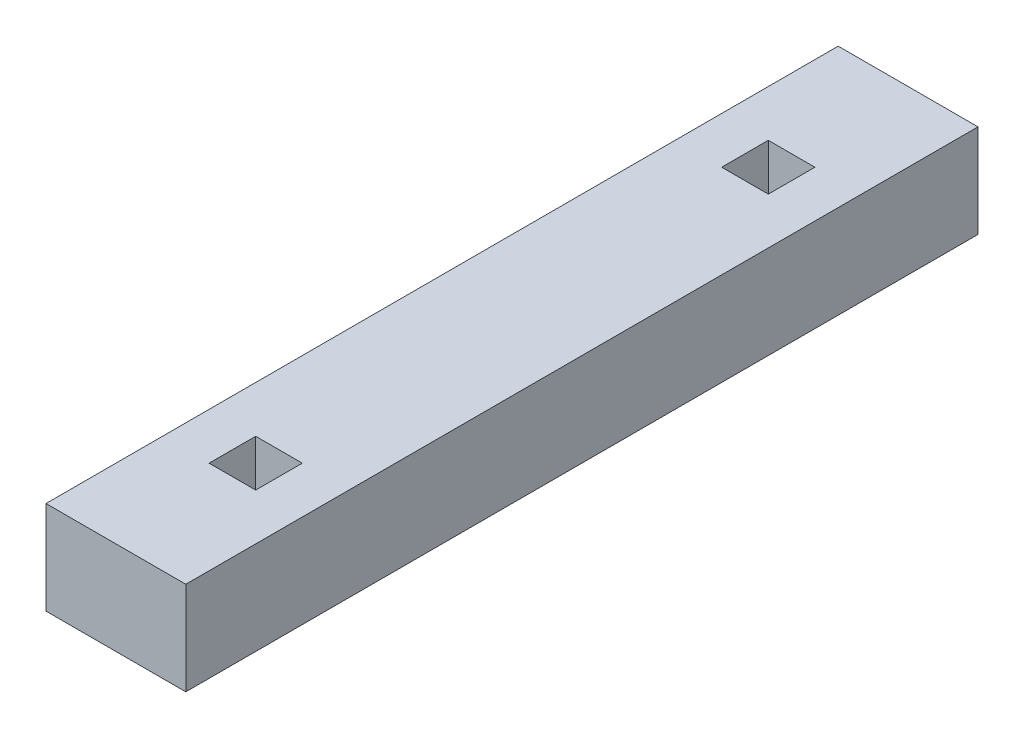
ISO-10303-21;
HEADER;
FILE_DESCRIPTION(('STEP AP214'),'2;1');
FILE_NAME('part.step','',(''),(''),'','','');
FILE_SCHEMA(('AUTOMOTIVE_DESIGN { 1 0 10303 214 1 1 1 1 }'));
ENDSEC;
DATA;
#1=APPLICATION_CONTEXT('core data for automotive mechanical design processes');
#2=APPLICATION_PROTOCOL_DEFINITION('international standard','automotive_design',2000,#1);
#3=PRODUCT_CONTEXT('',#1,'mechanical');
#4=PRODUCT('Part','Part','',(#3));
#5=PRODUCT_RELATED_PRODUCT_CATEGORY('part','',(#4));
#6=PRODUCT_DEFINITION_FORMATION('','',#4);
#7=PRODUCT_DEFINITION_CONTEXT('part definition',#1,'design');
#8=PRODUCT_DEFINITION('design','',#6,#7);
#9=PRODUCT_DEFINITION_SHAPE('','',#8);
#10=(LENGTH_UNIT() NAMED_UNIT(*) SI_UNIT(.MILLI.,.METRE.));
#11=(NAMED_UNIT(*) PLANE_ANGLE_UNIT() SI_UNIT($,.RADIAN.));
#12=(NAMED_UNIT(*) SI_UNIT($,.STERADIAN.) SOLID_ANGLE_UNIT());
#13=UNCERTAINTY_MEASURE_WITH_UNIT(LENGTH_MEASURE(1.E-05),#10,'distance_accuracy_value','');
#14=(GEOMETRIC_REPRESENTATION_CONTEXT(3) GLOBAL_UNCERTAINTY_ASSIGNED_CONTEXT((#13)) GLOBAL_UNIT_ASSIGNED_CONTEXT((#10,
#11,#12)) REPRESENTATION_CONTEXT('',''));
#15=CARTESIAN_POINT('',(0.,0.,0.));
#16=DIRECTION('',(0.,0.,1.));
#17=DIRECTION('',(1.,0.,0.));
#18=AXIS2_PLACEMENT_3D('',#15,#16,#17);
#19=CARTESIAN_POINT('',(0.,20.,0.));
#20=DIRECTION('',(0.,1.,0.));
#21=DIRECTION('',(0.,0.,1.));
#22=AXIS2_PLACEMENT_3D('',#19,#20,#21);
#23=PLANE('',#22);
#24=DIRECTION('',(0.,0.,1.));
#25=VECTOR('',#24,1.);
#26=CARTESIAN_POINT('',(-15.,20.,-80.));
#27=LINE('',#26,#25);
#28=CARTESIAN_POINT('',(-15.,20.,-80.));
#29=VERTEX_POINT('',#28);
#30=CARTESIAN_POINT('',(-15.,20.,90.));
#31=VERTEX_POINT('',#30);
#32=EDGE_CURVE('E189',#29,#31,#27,.T.);
#33=ORIENTED_EDGE('',*,*,#32,.T.);
#34=DIRECTION('',(1.,0.,0.));
#35=VECTOR('',#34,1.);
#36=CARTESIAN_POINT('',(-15.,20.,90.));
#37=LINE('',#36,#35);
#38=CARTESIAN_POINT('',(15.,20.,90.));
#39=VERTEX_POINT('',#38);
#40=EDGE_CURVE('E192',#31,#39,#37,.T.);
#41=ORIENTED_EDGE('',*,*,#40,.T.);
#42=DIRECTION('',(0.,0.,-1.));
#43=VECTOR('',#42,1.);
#44=CARTESIAN_POINT('',(15.,20.,-80.));
#45=LINE('',#44,#43);
#46=CARTESIAN_POINT('',(15.,20.,-80.));
#47=VERTEX_POINT('',#46);
#48=EDGE_CURVE('E195',#39,#47,#45,.T.);
#49=ORIENTED_EDGE('',*,*,#48,.T.);
#50=DIRECTION('',(-1.,0.,0.));
#51=VECTOR('',#50,1.);
#52=CARTESIAN_POINT('',(-15.,20.,-80.));
#53=LINE('',#52,#51);
#54=EDGE_CURVE('E197',#47,#29,#53,.T.);
#55=ORIENTED_EDGE('',*,*,#54,.T.);
#56=EDGE_LOOP('',(#33,#41,#49,#55));
#57=FACE_BOUND('',#56,.T.);
#58=DIRECTION('',(1.,0.,0.));
#59=VECTOR('',#58,1.);
#60=CARTESIAN_POINT('',(-5.,20.,-45.));
#61=LINE('',#60,#59);
#62=CARTESIAN_POINT('',(-5.,20.,-45.));
#63=VERTEX_POINT('',#62);
#64=CARTESIAN_POINT('',(5.,20.,-45.));
#65=VERTEX_POINT('',#64);
#66=EDGE_CURVE('E160',#63,#65,#61,.T.);
#67=ORIENTED_EDGE('',*,*,#66,.F.);
#68=DIRECTION('',(0.,0.,1.));
#69=VECTOR('',#68,1.);
#70=CARTESIAN_POINT('',(-5.,20.,-55.));
#71=LINE('',#70,#69);
#72=CARTESIAN_POINT('',(-5.,20.,-55.));
#73=VERTEX_POINT('',#72);
#74=EDGE_CURVE('E158',#73,#63,#71,.T.);
#75=ORIENTED_EDGE('',*,*,#74,.F.);
#76=DIRECTION('',(-1.,0.,0.));
#77=VECTOR('',#76,1.);
#78=CARTESIAN_POINT('',(-5.,20.,-55.));
#79=LINE('',#78,#77);
#80=CARTESIAN_POINT('',(5.,20.,-55.));
#81=VERTEX_POINT('',#80);
#82=EDGE_CURVE('E166',#81,#73,#79,.T.);
#83=ORIENTED_EDGE('',*,*,#82,.F.);
#84=DIRECTION('',(0.,0.,-1.));
#85=VECTOR('',#84,1.);
#86=CARTESIAN_POINT('',(5.,20.,-55.));
#87=LINE('',#86,#85);
#88=EDGE_CURVE('E163',#65,#81,#87,.T.);
#89=ORIENTED_EDGE('',*,*,#88,.F.);
#90=EDGE_LOOP('',(#67,#75,#83,#89));
#91=FACE_BOUND('',#90,.T.);
#92=DIRECTION('',(0.,0.,-1.));
#93=VECTOR('',#92,1.);
#94=CARTESIAN_POINT('',(5.,20.,65.));
#95=LINE('',#94,#93);
#96=CARTESIAN_POINT('',(5.,20.,65.));
#97=VERTEX_POINT('',#96);
#98=CARTESIAN_POINT('',(5.,20.,55.));
#99=VERTEX_POINT('',#98);
#100=EDGE_CURVE('E130',#97,#99,#95,.T.);
#101=ORIENTED_EDGE('',*,*,#100,.F.);
#102=DIRECTION('',(1.,0.,0.));
#103=VECTOR('',#102,1.);
#104=CARTESIAN_POINT('',(-5.,20.,65.));
#105=LINE('',#104,#103);
#106=CARTESIAN_POINT('',(-5.,20.,65.));
#107=VERTEX_POINT('',#106);
#108=EDGE_CURVE('E122',#107,#97,#105,.T.);
#109=ORIENTED_EDGE('',*,*,#108,.F.);
#110=DIRECTION('',(0.,0.,1.));
#111=VECTOR('',#110,1.);
#112=CARTESIAN_POINT('',(-5.,20.,65.));
#113=LINE('',#112,#111);
#114=CARTESIAN_POINT('',(-5.,20.,55.));
#115=VERTEX_POINT('',#114);
#116=EDGE_CURVE('E144',#115,#107,#113,.T.);
#117=ORIENTED_EDGE('',*,*,#116,.F.);
#118=DIRECTION('',(-1.,0.,0.));
#119=VECTOR('',#118,1.);
#120=CARTESIAN_POINT('',(-5.,20.,55.));
#121=LINE('',#120,#119);
#122=EDGE_CURVE('E142',#99,#115,#121,.T.);
#123=ORIENTED_EDGE('',*,*,#122,.F.);
#124=EDGE_LOOP('',(#101,#109,#117,#123));
#125=FACE_BOUND('',#124,.T.);
#126=ADVANCED_FACE('F33',(#57,#91,#125),#23,.T.);
#127=CARTESIAN_POINT('',(0.,0.,0.));
#128=DIRECTION('',(0.,1.,0.));
#129=DIRECTION('',(0.,0.,1.));
#130=AXIS2_PLACEMENT_3D('',#127,#128,#129);
#131=PLANE('',#130);
#132=DIRECTION('',(0.,0.,1.));
#133=VECTOR('',#132,1.);
#134=CARTESIAN_POINT('',(-5.,0.,-55.));
#135=LINE('',#134,#133);
#136=CARTESIAN_POINT('',(-5.,0.,-55.));
#137=VERTEX_POINT('',#136);
#138=CARTESIAN_POINT('',(-5.,0.,-45.));
#139=VERTEX_POINT('',#138);
#140=EDGE_CURVE('E138',#137,#139,#135,.T.);
#141=ORIENTED_EDGE('',*,*,#140,.T.);
#142=DIRECTION('',(1.,0.,0.));
#143=VECTOR('',#142,1.);
#144=CARTESIAN_POINT('',(-5.,0.,-45.));
#145=LINE('',#144,#143);
#146=CARTESIAN_POINT('',(5.,0.,-45.));
#147=VERTEX_POINT('',#146);
#148=EDGE_CURVE('E171',#139,#147,#145,.T.);
#149=ORIENTED_EDGE('',*,*,#148,.T.);
#150=DIRECTION('',(0.,0.,-1.));
#151=VECTOR('',#150,1.);
#152=CARTESIAN_POINT('',(5.,0.,-55.));
#153=LINE('',#152,#151);
#154=CARTESIAN_POINT('',(5.,0.,-55.));
#155=VERTEX_POINT('',#154);
#156=EDGE_CURVE('E174',#147,#155,#153,.T.);
#157=ORIENTED_EDGE('',*,*,#156,.T.);
#158=DIRECTION('',(-1.,0.,0.));
#159=VECTOR('',#158,1.);
#160=CARTESIAN_POINT('',(-5.,0.,-55.));
#161=LINE('',#160,#159);
#162=EDGE_CURVE('E161',#155,#137,#161,.T.);
#163=ORIENTED_EDGE('',*,*,#162,.T.);
#164=EDGE_LOOP('',(#141,#149,#157,#163));
#165=FACE_BOUND('',#164,.T.);
#166=DIRECTION('',(0.,0.,1.));
#167=VECTOR('',#166,1.);
#168=CARTESIAN_POINT('',(-15.,0.,-80.));
#169=LINE('',#168,#167);
#170=CARTESIAN_POINT('',(-15.,0.,-80.));
#171=VERTEX_POINT('',#170);
#172=CARTESIAN_POINT('',(-15.,0.,90.));
#173=VERTEX_POINT('',#172);
#174=EDGE_CURVE('E188',#171,#173,#169,.T.);
#175=ORIENTED_EDGE('',*,*,#174,.F.);
#176=DIRECTION('',(-1.,0.,0.));
#177=VECTOR('',#176,1.);
#178=CARTESIAN_POINT('',(-15.,0.,-80.));
#179=LINE('',#178,#177);
#180=CARTESIAN_POINT('',(15.,0.,-80.));
#181=VERTEX_POINT('',#180);
#182=EDGE_CURVE('E193',#181,#171,#179,.T.);
#183=ORIENTED_EDGE('',*,*,#182,.F.);
#184=DIRECTION('',(0.,0.,-1.));
#185=VECTOR('',#184,1.);
#186=CARTESIAN_POINT('',(15.,0.,-80.));
#187=LINE('',#186,#185);
#188=CARTESIAN_POINT('',(15.,0.,90.));
#189=VERTEX_POINT('',#188);
#190=EDGE_CURVE('E204',#189,#181,#187,.T.);
#191=ORIENTED_EDGE('',*,*,#190,.F.);
#192=DIRECTION('',(1.,0.,0.));
#193=VECTOR('',#192,1.);
#194=CARTESIAN_POINT('',(-15.,0.,90.));
#195=LINE('',#194,#193);
#196=EDGE_CURVE('E202',#173,#189,#195,.T.);
#197=ORIENTED_EDGE('',*,*,#196,.F.);
#198=EDGE_LOOP('',(#175,#183,#191,#197));
#199=FACE_BOUND('',#198,.T.);
#200=DIRECTION('',(1.,0.,0.));
#201=VECTOR('',#200,1.);
#202=CARTESIAN_POINT('',(-5.,0.,65.));
#203=LINE('',#202,#201);
#204=CARTESIAN_POINT('',(-5.,0.,65.));
#205=VERTEX_POINT('',#204);
#206=CARTESIAN_POINT('',(5.,0.,65.));
#207=VERTEX_POINT('',#206);
#208=EDGE_CURVE('E56',#205,#207,#203,.T.);
#209=ORIENTED_EDGE('',*,*,#208,.T.);
#210=DIRECTION('',(0.,0.,-1.));
#211=VECTOR('',#210,1.);
#212=CARTESIAN_POINT('',(5.,0.,65.));
#213=LINE('',#212,#211);
#214=CARTESIAN_POINT('',(5.,0.,55.));
#215=VERTEX_POINT('',#214);
#216=EDGE_CURVE('E137',#207,#215,#213,.T.);
#217=ORIENTED_EDGE('',*,*,#216,.T.);
#218=DIRECTION('',(-1.,0.,0.));
#219=VECTOR('',#218,1.);
#220=CARTESIAN_POINT('',(-5.,0.,55.));
#221=LINE('',#220,#219);
#222=CARTESIAN_POINT('',(-5.,0.,55.));
#223=VERTEX_POINT('',#222);
#224=EDGE_CURVE('E150',#215,#223,#221,.T.);
#225=ORIENTED_EDGE('',*,*,#224,.T.);
#226=DIRECTION('',(0.,0.,1.));
#227=VECTOR('',#226,1.);
#228=CARTESIAN_POINT('',(-5.,0.,65.));
#229=LINE('',#228,#227);
#230=EDGE_CURVE('E131',#223,#205,#229,.T.);
#231=ORIENTED_EDGE('',*,*,#230,.T.);
#232=EDGE_LOOP('',(#209,#217,#225,#231));
#233=FACE_BOUND('',#232,.T.);
#234=ADVANCED_FACE('F222',(#165,#199,#233),#131,.F.);
#235=CARTESIAN_POINT('',(-15.,20.,-80.));
#236=DIRECTION('',(1.,0.,0.));
#237=DIRECTION('',(0.,0.,-1.));
#238=AXIS2_PLACEMENT_3D('',#235,#236,#237);
#239=PLANE('',#238);
#240=ORIENTED_EDGE('',*,*,#174,.T.);
#241=DIRECTION('',(0.,-1.,0.));
#242=VECTOR('',#241,1.);
#243=CARTESIAN_POINT('',(-15.,20.,90.));
#244=LINE('',#243,#242);
#245=EDGE_CURVE('E11',#31,#173,#244,.T.);
#246=ORIENTED_EDGE('',*,*,#245,.F.);
#247=ORIENTED_EDGE('',*,*,#32,.F.);
#248=DIRECTION('',(0.,-1.,0.));
#249=VECTOR('',#248,1.);
#250=CARTESIAN_POINT('',(-15.,20.,-80.));
#251=LINE('',#250,#249);
#252=EDGE_CURVE('E199',#29,#171,#251,.T.);
#253=ORIENTED_EDGE('',*,*,#252,.T.);
#254=EDGE_LOOP('',(#240,#246,#247,#253));
#255=FACE_BOUND('',#254,.T.);
#256=ADVANCED_FACE('F35',(#255),#239,.F.);
#257=CARTESIAN_POINT('',(-15.,20.,90.));
#258=DIRECTION('',(0.,0.,-1.));
#259=DIRECTION('',(-1.,0.,0.));
#260=AXIS2_PLACEMENT_3D('',#257,#258,#259);
#261=PLANE('',#260);
#262=ORIENTED_EDGE('',*,*,#196,.T.);
#263=DIRECTION('',(0.,-1.,0.));
#264=VECTOR('',#263,1.);
#265=CARTESIAN_POINT('',(15.,20.,90.));
#266=LINE('',#265,#264);
#267=EDGE_CURVE('E41',#39,#189,#266,.T.);
#268=ORIENTED_EDGE('',*,*,#267,.F.);
#269=ORIENTED_EDGE('',*,*,#40,.F.);
#270=ORIENTED_EDGE('',*,*,#245,.T.);
#271=EDGE_LOOP('',(#262,#268,#269,#270));
#272=FACE_BOUND('',#271,.T.);
#273=ADVANCED_FACE('F233',(#272),#261,.F.);
#274=CARTESIAN_POINT('',(15.,20.,-80.));
#275=DIRECTION('',(-1.,0.,0.));
#276=DIRECTION('',(0.,0.,1.));
#277=AXIS2_PLACEMENT_3D('',#274,#275,#276);
#278=PLANE('',#277);
#279=ORIENTED_EDGE('',*,*,#190,.T.);
#280=DIRECTION('',(0.,-1.,0.));
#281=VECTOR('',#280,1.);
#282=CARTESIAN_POINT('',(15.,20.,-80.));
#283=LINE('',#282,#281);
#284=EDGE_CURVE('E209',#47,#181,#283,.T.);
#285=ORIENTED_EDGE('',*,*,#284,.F.);
#286=ORIENTED_EDGE('',*,*,#48,.F.);
#287=ORIENTED_EDGE('',*,*,#267,.T.);
#288=EDGE_LOOP('',(#279,#285,#286,#287));
#289=FACE_BOUND('',#288,.T.);
#290=ADVANCED_FACE('F216',(#289),#278,.F.);
#291=CARTESIAN_POINT('',(-15.,20.,-80.));
#292=DIRECTION('',(0.,0.,1.));
#293=DIRECTION('',(1.,0.,0.));
#294=AXIS2_PLACEMENT_3D('',#291,#292,#293);
#295=PLANE('',#294);
#296=ORIENTED_EDGE('',*,*,#182,.T.);
#297=ORIENTED_EDGE('',*,*,#252,.F.);
#298=ORIENTED_EDGE('',*,*,#54,.F.);
#299=ORIENTED_EDGE('',*,*,#284,.T.);
#300=EDGE_LOOP('',(#296,#297,#298,#299));
#301=FACE_BOUND('',#300,.T.);
#302=ADVANCED_FACE('F226',(#301),#295,.F.);
#303=CARTESIAN_POINT('',(-5.,20.,-55.));
#304=DIRECTION('',(1.,0.,0.));
#305=DIRECTION('',(0.,0.,-1.));
#306=AXIS2_PLACEMENT_3D('',#303,#304,#305);
#307=PLANE('',#306);
#308=ORIENTED_EDGE('',*,*,#140,.F.);
#309=DIRECTION('',(0.,-1.,0.));
#310=VECTOR('',#309,1.);
#311=CARTESIAN_POINT('',(-5.,20.,-55.));
#312=LINE('',#311,#310);
#313=EDGE_CURVE('E168',#73,#137,#312,.T.);
#314=ORIENTED_EDGE('',*,*,#313,.F.);
#315=ORIENTED_EDGE('',*,*,#74,.T.);
#316=DIRECTION('',(0.,-1.,0.));
#317=VECTOR('',#316,1.);
#318=CARTESIAN_POINT('',(-5.,20.,-45.));
#319=LINE('',#318,#317);
#320=EDGE_CURVE('E185',#63,#139,#319,.T.);
#321=ORIENTED_EDGE('',*,*,#320,.T.);
#322=EDGE_LOOP('',(#308,#314,#315,#321));
#323=FACE_BOUND('',#322,.T.);
#324=ADVANCED_FACE('F248',(#323),#307,.T.);
#325=CARTESIAN_POINT('',(-5.,20.,-45.));
#326=DIRECTION('',(0.,0.,-1.));
#327=DIRECTION('',(-1.,0.,0.));
#328=AXIS2_PLACEMENT_3D('',#325,#326,#327);
#329=PLANE('',#328);
#330=ORIENTED_EDGE('',*,*,#148,.F.);
#331=ORIENTED_EDGE('',*,*,#320,.F.);
#332=ORIENTED_EDGE('',*,*,#66,.T.);
#333=DIRECTION('',(0.,-1.,0.));
#334=VECTOR('',#333,1.);
#335=CARTESIAN_POINT('',(5.,20.,-45.));
#336=LINE('',#335,#334);
#337=EDGE_CURVE('E183',#65,#147,#336,.T.);
#338=ORIENTED_EDGE('',*,*,#337,.T.);
#339=EDGE_LOOP('',(#330,#331,#332,#338));
#340=FACE_BOUND('',#339,.T.);
#341=ADVANCED_FACE('F255',(#340),#329,.T.);
#342=CARTESIAN_POINT('',(5.,20.,-55.));
#343=DIRECTION('',(-1.,0.,0.));
#344=DIRECTION('',(0.,0.,1.));
#345=AXIS2_PLACEMENT_3D('',#342,#343,#344);
#346=PLANE('',#345);
#347=ORIENTED_EDGE('',*,*,#156,.F.);
#348=ORIENTED_EDGE('',*,*,#337,.F.);
#349=ORIENTED_EDGE('',*,*,#88,.T.);
#350=DIRECTION('',(0.,-1.,0.));
#351=VECTOR('',#350,1.);
#352=CARTESIAN_POINT('',(5.,20.,-55.));
#353=LINE('',#352,#351);
#354=EDGE_CURVE('E181',#81,#155,#353,.T.);
#355=ORIENTED_EDGE('',*,*,#354,.T.);
#356=EDGE_LOOP('',(#347,#348,#349,#355));
#357=FACE_BOUND('',#356,.T.);
#358=ADVANCED_FACE('F260',(#357),#346,.T.);
#359=CARTESIAN_POINT('',(-5.,20.,-55.));
#360=DIRECTION('',(0.,0.,1.));
#361=DIRECTION('',(1.,0.,0.));
#362=AXIS2_PLACEMENT_3D('',#359,#360,#361);
#363=PLANE('',#362);
#364=ORIENTED_EDGE('',*,*,#162,.F.);
#365=ORIENTED_EDGE('',*,*,#354,.F.);
#366=ORIENTED_EDGE('',*,*,#82,.T.);
#367=ORIENTED_EDGE('',*,*,#313,.T.);
#368=EDGE_LOOP('',(#364,#365,#366,#367));
#369=FACE_BOUND('',#368,.T.);
#370=ADVANCED_FACE('F267',(#369),#363,.T.);
#371=CARTESIAN_POINT('',(-5.,20.,65.));
#372=DIRECTION('',(0.,0.,-1.));
#373=DIRECTION('',(-1.,0.,0.));
#374=AXIS2_PLACEMENT_3D('',#371,#372,#373);
#375=PLANE('',#374);
#376=ORIENTED_EDGE('',*,*,#208,.F.);
#377=DIRECTION('',(0.,-1.,0.));
#378=VECTOR('',#377,1.);
#379=CARTESIAN_POINT('',(-5.,20.,65.));
#380=LINE('',#379,#378);
#381=EDGE_CURVE('E126',#107,#205,#380,.T.);
#382=ORIENTED_EDGE('',*,*,#381,.F.);
#383=ORIENTED_EDGE('',*,*,#108,.T.);
#384=DIRECTION('',(0.,-1.,0.));
#385=VECTOR('',#384,1.);
#386=CARTESIAN_POINT('',(5.,20.,65.));
#387=LINE('',#386,#385);
#388=EDGE_CURVE('E125',#97,#207,#387,.T.);
#389=ORIENTED_EDGE('',*,*,#388,.T.);
#390=EDGE_LOOP('',(#376,#382,#383,#389));
#391=FACE_BOUND('',#390,.T.);
#392=ADVANCED_FACE('F124',(#391),#375,.T.);
#393=CARTESIAN_POINT('',(5.,20.,65.));
#394=DIRECTION('',(-1.,0.,0.));
#395=DIRECTION('',(0.,0.,1.));
#396=AXIS2_PLACEMENT_3D('',#393,#394,#395);
#397=PLANE('',#396);
#398=ORIENTED_EDGE('',*,*,#216,.F.);
#399=ORIENTED_EDGE('',*,*,#388,.F.);
#400=ORIENTED_EDGE('',*,*,#100,.T.);
#401=DIRECTION('',(0.,-1.,0.));
#402=VECTOR('',#401,1.);
#403=CARTESIAN_POINT('',(5.,20.,55.));
#404=LINE('',#403,#402);
#405=EDGE_CURVE('E139',#99,#215,#404,.T.);
#406=ORIENTED_EDGE('',*,*,#405,.T.);
#407=EDGE_LOOP('',(#398,#399,#400,#406));
#408=FACE_BOUND('',#407,.T.);
#409=ADVANCED_FACE('F134',(#408),#397,.T.);
#410=CARTESIAN_POINT('',(-5.,20.,55.));
#411=DIRECTION('',(0.,0.,1.));
#412=DIRECTION('',(1.,0.,0.));
#413=AXIS2_PLACEMENT_3D('',#410,#411,#412);
#414=PLANE('',#413);
#415=ORIENTED_EDGE('',*,*,#224,.F.);
#416=ORIENTED_EDGE('',*,*,#405,.F.);
#417=ORIENTED_EDGE('',*,*,#122,.T.);
#418=DIRECTION('',(0.,-1.,0.));
#419=VECTOR('',#418,1.);
#420=CARTESIAN_POINT('',(-5.,20.,55.));
#421=LINE('',#420,#419);
#422=EDGE_CURVE('E48',#115,#223,#421,.T.);
#423=ORIENTED_EDGE('',*,*,#422,.T.);
#424=EDGE_LOOP('',(#415,#416,#417,#423));
#425=FACE_BOUND('',#424,.T.);
#426=ADVANCED_FACE('F285',(#425),#414,.T.);
#427=CARTESIAN_POINT('',(-5.,20.,65.));
#428=DIRECTION('',(1.,0.,0.));
#429=DIRECTION('',(0.,0.,-1.));
#430=AXIS2_PLACEMENT_3D('',#427,#428,#429);
#431=PLANE('',#430);
#432=ORIENTED_EDGE('',*,*,#230,.F.);
#433=ORIENTED_EDGE('',*,*,#422,.F.);
#434=ORIENTED_EDGE('',*,*,#116,.T.);
#435=ORIENTED_EDGE('',*,*,#381,.T.);
#436=EDGE_LOOP('',(#432,#433,#434,#435));
#437=FACE_BOUND('',#436,.T.);
#438=ADVANCED_FACE('F288',(#437),#431,.T.);
#439=CLOSED_SHELL('',(#126,#234,#256,#273,#290,#302,#324,#341,#358,#370,#392,#409,#426,#438));
#440=MANIFOLD_SOLID_BREP('B2',#439);
#441=ADVANCED_BREP_SHAPE_REPRESENTATION('',(#18,#440),#14);
#442=SHAPE_DEFINITION_REPRESENTATION(#9,#441);
ENDSEC;
END-ISO-10303-21;
